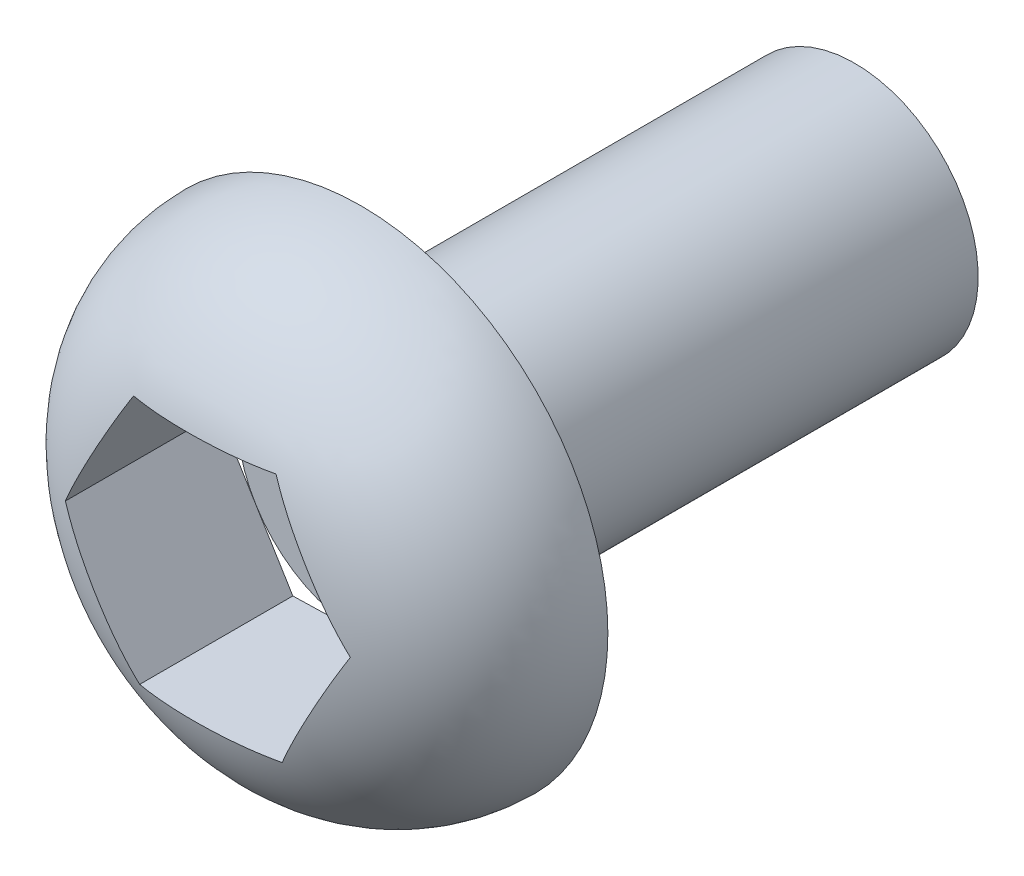
ISO-10303-21;
HEADER;
FILE_DESCRIPTION(('STEP AP214'),'2;1');
FILE_NAME('part.step','',(''),(''),'','','');
FILE_SCHEMA(('AUTOMOTIVE_DESIGN { 1 0 10303 214 1 1 1 1 }'));
ENDSEC;
DATA;
#1=APPLICATION_CONTEXT('core data for automotive mechanical design processes');
#2=APPLICATION_PROTOCOL_DEFINITION('international standard','automotive_design',2000,#1);
#3=PRODUCT_CONTEXT('',#1,'mechanical');
#4=PRODUCT('Part','Part','',(#3));
#5=PRODUCT_RELATED_PRODUCT_CATEGORY('part','',(#4));
#6=PRODUCT_DEFINITION_FORMATION('','',#4);
#7=PRODUCT_DEFINITION_CONTEXT('part definition',#1,'design');
#8=PRODUCT_DEFINITION('design','',#6,#7);
#9=PRODUCT_DEFINITION_SHAPE('','',#8);
#10=(LENGTH_UNIT() NAMED_UNIT(*) SI_UNIT(.MILLI.,.METRE.));
#11=(NAMED_UNIT(*) PLANE_ANGLE_UNIT() SI_UNIT($,.RADIAN.));
#12=(NAMED_UNIT(*) SI_UNIT($,.STERADIAN.) SOLID_ANGLE_UNIT());
#13=UNCERTAINTY_MEASURE_WITH_UNIT(LENGTH_MEASURE(1.E-05),#10,'distance_accuracy_value','');
#14=(GEOMETRIC_REPRESENTATION_CONTEXT(3) GLOBAL_UNCERTAINTY_ASSIGNED_CONTEXT((#13)) GLOBAL_UNIT_ASSIGNED_CONTEXT((#10,
#11,#12)) REPRESENTATION_CONTEXT('',''));
#15=CARTESIAN_POINT('',(0.,0.,0.));
#16=DIRECTION('',(0.,0.,1.));
#17=DIRECTION('',(1.,0.,0.));
#18=AXIS2_PLACEMENT_3D('',#15,#16,#17);
#19=CARTESIAN_POINT('',(0.,0.,-6.));
#20=DIRECTION('',(0.,0.,1.));
#21=DIRECTION('',(1.,0.,0.));
#22=AXIS2_PLACEMENT_3D('',#19,#20,#21);
#23=CYLINDRICAL_SURFACE('',#22,1.5);
#24=CARTESIAN_POINT('',(0.,0.,-6.));
#25=DIRECTION('',(0.,0.,-1.));
#26=DIRECTION('',(-1.,0.,0.));
#27=AXIS2_PLACEMENT_3D('',#24,#25,#26);
#28=CIRCLE('',#27,1.5);
#29=CARTESIAN_POINT('',(-1.5,0.,-6.));
#30=VERTEX_POINT('',#29);
#31=EDGE_CURVE('E11',#30,#30,#28,.T.);
#32=ORIENTED_EDGE('',*,*,#31,.F.);
#33=EDGE_LOOP('',(#32));
#34=FACE_BOUND('',#33,.T.);
#35=CARTESIAN_POINT('',(0.,0.,0.));
#36=DIRECTION('',(0.,0.,-1.));
#37=DIRECTION('',(-1.,0.,0.));
#38=AXIS2_PLACEMENT_3D('',#35,#36,#37);
#39=CIRCLE('',#38,1.5);
#40=CARTESIAN_POINT('',(-1.5,0.,0.));
#41=VERTEX_POINT('',#40);
#42=EDGE_CURVE('E43',#41,#41,#39,.T.);
#43=ORIENTED_EDGE('',*,*,#42,.T.);
#44=EDGE_LOOP('',(#43));
#45=FACE_BOUND('',#44,.T.);
#46=ADVANCED_FACE('F40',(#34,#45),#23,.T.);
#47=CARTESIAN_POINT('',(0.,0.,-6.));
#48=DIRECTION('',(0.,0.,-1.));
#49=DIRECTION('',(-1.,0.,0.));
#50=AXIS2_PLACEMENT_3D('',#47,#48,#49);
#51=PLANE('',#50);
#52=ORIENTED_EDGE('',*,*,#31,.T.);
#53=EDGE_LOOP('',(#52));
#54=FACE_BOUND('',#53,.T.);
#55=ADVANCED_FACE('F55',(#54),#51,.T.);
#56=CARTESIAN_POINT('',(0.,0.,0.));
#57=DIRECTION('',(0.,0.,-1.));
#58=DIRECTION('',(-1.,0.,0.));
#59=AXIS2_PLACEMENT_3D('',#56,#57,#58);
#60=PLANE('',#59);
#61=ORIENTED_EDGE('',*,*,#42,.F.);
#62=EDGE_LOOP('',(#61));
#63=FACE_BOUND('',#62,.T.);
#64=ADVANCED_FACE('F53',(#63),#60,.F.);
#65=CLOSED_SHELL('',(#46,#55,#64));
#66=MANIFOLD_SOLID_BREP('B2',#65);
#67=CARTESIAN_POINT('',(0.,0.,0.));
#68=DIRECTION('',(0.,0.,1.));
#69=DIRECTION('',(1.,0.,0.));
#70=AXIS2_PLACEMENT_3D('',#67,#68,#69);
#71=PLANE('',#70);
#72=DIRECTION('',(0.521372639478787,-0.853329110486056,0.));
#73=VECTOR('',#72,1.);
#74=CARTESIAN_POINT('',(-1.73151561635586,-0.0430542717484789,0.));
#75=LINE('',#74,#73);
#76=CARTESIAN_POINT('',(-1.73151561635586,-0.0430542717484789,0.));
#77=VERTEX_POINT('',#76);
#78=CARTESIAN_POINT('',(-1.27999366572909,-0.782058959218184,0.));
#79=VERTEX_POINT('',#78);
#80=EDGE_CURVE('E170',#77,#79,#75,.T.);
#81=ORIENTED_EDGE('',*,*,#80,.T.);
#82=CARTESIAN_POINT('',(-0.828471715102311,-1.52106364668789,0.));
#83=VERTEX_POINT('',#82);
#84=EDGE_CURVE('E109',#79,#83,#75,.T.);
#85=ORIENTED_EDGE('',*,*,#84,.T.);
#86=DIRECTION('',(0.999691007209096,0.0248573953837473,0.));
#87=VECTOR('',#86,1.);
#88=CARTESIAN_POINT('',(-0.828471715102311,-1.52106364668789,0.));
#89=LINE('',#88,#87);
#90=CARTESIAN_POINT('',(0.0372860930756212,-1.49953651081365,0.));
#91=VERTEX_POINT('',#90);
#92=EDGE_CURVE('E161',#83,#91,#89,.T.);
#93=ORIENTED_EDGE('',*,*,#92,.T.);
#94=CARTESIAN_POINT('',(0.903043901253554,-1.47800937493941,0.));
#95=VERTEX_POINT('',#94);
#96=EDGE_CURVE('E101',#91,#95,#89,.T.);
#97=ORIENTED_EDGE('',*,*,#96,.T.);
#98=DIRECTION('',(0.478318367730309,0.878186505869803,0.));
#99=VECTOR('',#98,1.);
#100=CARTESIAN_POINT('',(0.903043901253554,-1.47800937493941,0.));
#101=LINE('',#100,#99);
#102=CARTESIAN_POINT('',(1.31727975880471,-0.717477551595466,0.));
#103=VERTEX_POINT('',#102);
#104=EDGE_CURVE('E160',#95,#103,#101,.T.);
#105=ORIENTED_EDGE('',*,*,#104,.T.);
#106=CARTESIAN_POINT('',(1.73151561635587,0.0430542717484784,0.));
#107=VERTEX_POINT('',#106);
#108=EDGE_CURVE('E174',#103,#107,#101,.T.);
#109=ORIENTED_EDGE('',*,*,#108,.T.);
#110=DIRECTION('',(-0.521372639478787,0.853329110486056,0.));
#111=VECTOR('',#110,1.);
#112=CARTESIAN_POINT('',(1.73151561635587,0.0430542717484784,0.));
#113=LINE('',#112,#111);
#114=CARTESIAN_POINT('',(1.27999366572909,0.782058959218184,0.));
#115=VERTEX_POINT('',#114);
#116=EDGE_CURVE('E177',#107,#115,#113,.T.);
#117=ORIENTED_EDGE('',*,*,#116,.T.);
#118=CARTESIAN_POINT('',(0.828471715102311,1.52106364668789,0.));
#119=VERTEX_POINT('',#118);
#120=EDGE_CURVE('E175',#115,#119,#113,.T.);
#121=ORIENTED_EDGE('',*,*,#120,.T.);
#122=DIRECTION('',(-0.999691007209096,-0.0248573953837472,0.));
#123=VECTOR('',#122,1.);
#124=CARTESIAN_POINT('',(0.828471715102311,1.52106364668789,0.));
#125=LINE('',#124,#123);
#126=CARTESIAN_POINT('',(-0.0372860930756214,1.49953651081365,0.));
#127=VERTEX_POINT('',#126);
#128=EDGE_CURVE('E182',#119,#127,#125,.T.);
#129=ORIENTED_EDGE('',*,*,#128,.T.);
#130=CARTESIAN_POINT('',(-0.903043901253553,1.47800937493941,0.));
#131=VERTEX_POINT('',#130);
#132=EDGE_CURVE('E181',#127,#131,#125,.T.);
#133=ORIENTED_EDGE('',*,*,#132,.T.);
#134=DIRECTION('',(-0.478318367730308,-0.878186505869803,0.));
#135=VECTOR('',#134,1.);
#136=CARTESIAN_POINT('',(-0.903043901253553,1.47800937493941,0.));
#137=LINE('',#136,#135);
#138=CARTESIAN_POINT('',(-1.31727975880471,0.717477551595465,0.));
#139=VERTEX_POINT('',#138);
#140=EDGE_CURVE('E186',#131,#139,#137,.T.);
#141=ORIENTED_EDGE('',*,*,#140,.T.);
#142=EDGE_CURVE('E185',#139,#77,#137,.T.);
#143=ORIENTED_EDGE('',*,*,#142,.T.);
#144=EDGE_LOOP('',(#81,#85,#93,#97,#105,#109,#117,#121,#129,#133,#141,#143));
#145=FACE_BOUND('',#144,.T.);
#146=CARTESIAN_POINT('',(0.,0.,0.));
#147=DIRECTION('',(0.,0.,1.));
#148=DIRECTION('',(1.,0.,0.));
#149=AXIS2_PLACEMENT_3D('',#146,#147,#148);
#150=CIRCLE('',#149,3.);
#151=CARTESIAN_POINT('',(3.,0.,0.));
#152=VERTEX_POINT('',#151);
#153=EDGE_CURVE('E192',#152,#152,#150,.T.);
#154=ORIENTED_EDGE('',*,*,#153,.F.);
#155=EDGE_LOOP('',(#154));
#156=FACE_BOUND('',#155,.T.);
#157=ADVANCED_FACE('F80',(#145,#156),#71,.F.);
#158=CARTESIAN_POINT('',(0.,0.,0.));
#159=DIRECTION('',(0.,0.,1.));
#160=DIRECTION('',(1.,0.,0.));
#161=AXIS2_PLACEMENT_3D('',#158,#159,#160);
#162=DEGENERATE_TOROIDAL_SURFACE('',#161,1.,2.,.T.);
#163=CARTESIAN_POINT('',(-0.828671715101672,-1.52106861970358,1.86117036754525));
#164=CARTESIAN_POINT('',(-0.765966553261592,-1.5195094509312,1.87350378303623));
#165=CARTESIAN_POINT('',(-0.702928643774431,-1.51794200836246,1.88399281541913));
#166=CARTESIAN_POINT('',(-0.576443559137105,-1.51479694680214,1.90175672912946));
#167=CARTESIAN_POINT('',(-0.512996709152393,-1.51321933589582,1.90903390522359));
#168=CARTESIAN_POINT('',(-0.385738320870283,-1.51005504607965,1.92087628413406));
#169=CARTESIAN_POINT('',(-0.321926317699427,-1.50846835561069,1.92543628547369));
#170=CARTESIAN_POINT('',(-0.194167795691199,-1.50529162993015,1.93220786361133));
#171=CARTESIAN_POINT('',(-0.130221250902539,-1.5037015940733,1.93441893572339));
#172=CARTESIAN_POINT('',(-0.00328276884435323,-1.5005452587505,1.93669521881096));
#173=CARTESIAN_POINT('',(0.0597085639782001,-1.49897897431418,1.93679323546166));
#174=CARTESIAN_POINT('',(0.18565157643713,-1.49584739142113,1.93493188358785));
#175=CARTESIAN_POINT('',(0.248603256240986,-1.49428209296024,1.93297252381203));
#176=CARTESIAN_POINT('',(0.43720269598584,-1.48959255308333,1.92375441500835));
#177=CARTESIAN_POINT('',(0.562748390564888,-1.48647084953056,1.91315901000463));
#178=CARTESIAN_POINT('',(0.705501327273295,-1.48292128655124,1.89413681004035));
#179=CARTESIAN_POINT('',(0.723530816900954,-1.48247298187608,1.89160587135801));
#180=CARTESIAN_POINT('',(0.759549522614612,-1.48157737393055,1.88627745550945));
#181=CARTESIAN_POINT('',(0.777538741595959,-1.48113007058818,1.88347999817915));
#182=CARTESIAN_POINT('',(0.813510580385348,-1.48023562799239,1.87760142504886));
#183=CARTESIAN_POINT('',(0.831493102436685,-1.47978849116971,1.8745197109786));
#184=CARTESIAN_POINT('',(0.867408183704175,-1.47889545985417,1.86806577428298));
#185=CARTESIAN_POINT('',(0.885340736609249,-1.47844956551823,1.86469351653898));
#186=CARTESIAN_POINT('',(0.90324390125292,-1.47800440192372,1.86117036754528));
#187=B_SPLINE_CURVE_WITH_KNOTS('',3,(#163,#164,#165,#166,#167,#168,#169,#170,#171,#172,#173,
#174,#175,#176,#177,#178,#179,#180,#181,#182,#183,#184,#185,#186),.UNSPECIFIED.,.F.,.F.,(4,2,2,
2,2,2,2,2,2,2,2,4),(0.,0.191707008191912,0.383276825367631,0.575212195470817,0.767188796065346,
0.956182732010759,1.14517586429125,1.52270193708336,1.57733644031974,1.631966880499,
1.68671504479797,1.741469835935),.UNSPECIFIED.);
#188=CARTESIAN_POINT('',(-0.828471715102311,-1.52106364668789,1.8612097182042));
#189=VERTEX_POINT('',#188);
#190=CARTESIAN_POINT('',(0.903043901253552,-1.47800937493941,1.8612097182042));
#191=VERTEX_POINT('',#190);
#192=EDGE_CURVE('E38',#189,#191,#187,.T.);
#193=ORIENTED_EDGE('',*,*,#192,.F.);
#194=CARTESIAN_POINT('',(-1.73163781367295,-0.0428542717484789,1.86116361686263));
#195=CARTESIAN_POINT('',(-1.69893569671316,-0.0963777332101476,1.87349745497733));
#196=CARTESIAN_POINT('',(-1.66606003222183,-0.150185239421195,1.88398693744174));
#197=CARTESIAN_POINT('',(-1.60009524319698,-0.258149621284898,1.90175178425041));
#198=CARTESIAN_POINT('',(-1.56700628826867,-0.312306219345194,1.90902944346861));
#199=CARTESIAN_POINT('',(-1.50063819495245,-0.420930688191132,1.92087279753581));
#200=CARTESIAN_POINT('',(-1.46735881419053,-0.475398955669621,1.92543329304326));
#201=CARTESIAN_POINT('',(-1.40072988773599,-0.584450329368341,1.93220588293181));
#202=CARTESIAN_POINT('',(-1.36738032850618,-0.639033457744862,1.93441747261344));
#203=CARTESIAN_POINT('',(-1.30117905119309,-0.747384899314745,1.93669484127734));
#204=CARTESIAN_POINT('',(-1.26832764848591,-0.801152696332938,1.93679342509328));
#205=CARTESIAN_POINT('',(-1.20264551211647,-0.908654461402524,1.93493332131723));
#206=CARTESIAN_POINT('',(-1.16981477836669,-0.962388429597165,1.93297464249616));
#207=CARTESIAN_POINT('',(-1.07145583560961,-1.12337223038724,1.92375885515234));
#208=CARTESIAN_POINT('',(-1.00598083698699,-1.23053497369798,1.91316536923205));
#209=CARTESIAN_POINT('',(-0.931527165527318,-1.35239308520652,1.89414487327692));
#210=CARTESIAN_POINT('',(-0.922119770991773,-1.36779014098419,1.89161301503854));
#211=CARTESIAN_POINT('',(-0.903326003599466,-1.39854984641789,1.88628252004107));
#212=CARTESIAN_POINT('',(-0.893939629230037,-1.4139124985497,1.88348390315423));
#213=CARTESIAN_POINT('',(-0.875170323773509,-1.44463216720295,1.87760274959268));
#214=CARTESIAN_POINT('',(-0.865787443740509,-1.4599891001643,1.87451961379978));
#215=CARTESIAN_POINT('',(-0.847047765382749,-1.49066027822959,1.86806255977518));
#216=CARTESIAN_POINT('',(-0.837690970355875,-1.50597451793589,1.86468860635665));
#217=CARTESIAN_POINT('',(-0.82834951778522,-1.52126364668789,1.86116361686266));
#218=B_SPLINE_CURVE_WITH_KNOTS('',3,(#194,#195,#196,#197,#198,#199,#200,#201,#202,#203,#204,
#205,#206,#207,#208,#209,#210,#211,#212,#213,#214,#215,#216,#217),.UNSPECIFIED.,.F.,.F.,(4,2,2,
2,2,2,2,2,2,2,2,4),(0.,0.191703055206573,0.383268914372694,0.575200170686662,0.767172658121655,
0.956162538616065,1.14515161337473,1.52266971594647,1.57732970995917,1.63198563523767,
1.68675939789281,1.74153979710494),.UNSPECIFIED.);
#219=CARTESIAN_POINT('',(-1.73151561635586,-0.0430542717484789,1.8612097182042));
#220=VERTEX_POINT('',#219);
#221=EDGE_CURVE('E94',#220,#189,#218,.T.);
#222=ORIENTED_EDGE('',*,*,#221,.F.);
#223=CARTESIAN_POINT('',(-0.902934968045281,1.47820937493941,1.8611649220241));
#224=CARTESIAN_POINT('',(-0.932936718802925,1.42312653797278,1.87349867843235));
#225=CARTESIAN_POINT('',(-0.963097684275443,1.36775138479258,1.88398807388155));
#226=CARTESIAN_POINT('',(-1.0236154454978,1.25664153650658,1.901752740292));
#227=CARTESIAN_POINT('',(-1.05397208565183,1.20090712707272,1.90903030610646));
#228=CARTESIAN_POINT('',(-1.11485984676843,1.0891179636355,1.92087347164383));
#229=CARTESIAN_POINT('',(-1.14539119010308,1.03306280135981,1.92543387161238));
#230=CARTESIAN_POINT('',(-1.20651824571847,0.920834296233174,1.93220626589669));
#231=CARTESIAN_POINT('',(-1.23711397041804,0.864660930581403,1.93441775551558));
#232=CARTESIAN_POINT('',(-1.29784868638485,0.753152756113896,1.93669491430397));
#233=CARTESIAN_POINT('',(-1.32798738834355,0.697818478464985,1.93679338846982));
#234=CARTESIAN_POINT('',(-1.38824582801129,0.587184741290966,1.93493304340029));
#235=CARTESIAN_POINT('',(-1.4183655658006,0.531885281618494,1.93297423293155));
#236=CARTESIAN_POINT('',(-1.50860251694165,0.366211374511539,1.92375799678599));
#237=CARTESIAN_POINT('',(-1.56867091037906,0.255926559825602,1.91316413985631));
#238=CARTESIAN_POINT('',(-1.63697572882289,0.130519772442767,1.89414331445476));
#239=CARTESIAN_POINT('',(-1.64560549143181,0.114675636855889,1.8916116339789));
#240=CARTESIAN_POINT('',(-1.66284573404744,0.0830227682972245,1.88628154092131));
#241=CARTESIAN_POINT('',(-1.67145621544142,0.0672140327784016,1.88348314820481));
#242=CARTESIAN_POINT('',(-1.68867401957081,0.0356023609981858,1.87760249351455));
#243=CARTESIAN_POINT('',(-1.69728129548064,0.0197995107079627,1.87451963258659));
#244=CARTESIAN_POINT('',(-1.71447192371431,-0.0117622664695957,1.86806318125293));
#245=CARTESIAN_POINT('',(-1.72305527301376,-0.0275211878041595,1.86468955567359));
#246=CARTESIAN_POINT('',(-1.73162454956414,-0.0432542717484824,1.86116492202413));
#247=B_SPLINE_CURVE_WITH_KNOTS('',3,(#223,#224,#225,#226,#227,#228,#229,#230,#231,#232,#233,
#234,#235,#236,#237,#238,#239,#240,#241,#242,#243,#244,#245,#246),.UNSPECIFIED.,.F.,.F.,(4,2,2,
2,2,2,2,2,2,2,2,4),(0.,0.191703819449054,0.383270443828847,0.575202495472803,0.767175778116085,
0.956166442662227,1.14515630187296,1.52267594535045,1.57733101115074,1.63198200931479,
1.68675082295466,1.74152627127176),.UNSPECIFIED.);
#248=CARTESIAN_POINT('',(-0.903043901253553,1.47800937493941,1.8612097182042));
#249=VERTEX_POINT('',#248);
#250=EDGE_CURVE('E252',#249,#220,#247,.T.);
#251=ORIENTED_EDGE('',*,*,#250,.F.);
#252=CARTESIAN_POINT('',(0.828671715101672,1.52106861970358,1.86117036754525));
#253=CARTESIAN_POINT('',(0.765966553261592,1.5195094509312,1.87350378303623));
#254=CARTESIAN_POINT('',(0.702928643774431,1.51794200836246,1.88399281541913));
#255=CARTESIAN_POINT('',(0.576443559137105,1.51479694680214,1.90175672912946));
#256=CARTESIAN_POINT('',(0.512996709152393,1.51321933589582,1.90903390522359));
#257=CARTESIAN_POINT('',(0.385738320870283,1.51005504607965,1.92087628413406));
#258=CARTESIAN_POINT('',(0.321926317699427,1.50846835561069,1.92543628547369));
#259=CARTESIAN_POINT('',(0.194167795691199,1.50529162993015,1.93220786361133));
#260=CARTESIAN_POINT('',(0.130221250902539,1.5037015940733,1.93441893572339));
#261=CARTESIAN_POINT('',(0.00328276884435316,1.5005452587505,1.93669521881096));
#262=CARTESIAN_POINT('',(-0.0597085639782003,1.49897897431418,1.93679323546166));
#263=CARTESIAN_POINT('',(-0.18565157643713,1.49584739142113,1.93493188358785));
#264=CARTESIAN_POINT('',(-0.248603256240986,1.49428209296024,1.93297252381203));
#265=CARTESIAN_POINT('',(-0.43720269598584,1.48959255308333,1.92375441500835));
#266=CARTESIAN_POINT('',(-0.562748390564889,1.48647084953056,1.91315901000464));
#267=CARTESIAN_POINT('',(-0.705501327273296,1.48292128655124,1.89413681004035));
#268=CARTESIAN_POINT('',(-0.723530816900954,1.48247298187608,1.89160587135801));
#269=CARTESIAN_POINT('',(-0.759549522614612,1.48157737393055,1.88627745550945));
#270=CARTESIAN_POINT('',(-0.777538741595959,1.48113007058818,1.88347999817915));
#271=CARTESIAN_POINT('',(-0.813510580385348,1.4802356279924,1.87760142504886));
#272=CARTESIAN_POINT('',(-0.831493102436685,1.47978849116971,1.8745197109786));
#273=CARTESIAN_POINT('',(-0.867408183704174,1.47889545985417,1.86806577428298));
#274=CARTESIAN_POINT('',(-0.885340736609249,1.47844956551823,1.86469351653898));
#275=CARTESIAN_POINT('',(-0.90324390125292,1.47800440192372,1.86117036754528));
#276=B_SPLINE_CURVE_WITH_KNOTS('',3,(#252,#253,#254,#255,#256,#257,#258,#259,#260,#261,#262,
#263,#264,#265,#266,#267,#268,#269,#270,#271,#272,#273,#274,#275),.UNSPECIFIED.,.F.,.F.,(4,2,2,
2,2,2,2,2,2,2,2,4),(0.,0.191707008191912,0.38327682536763,0.575212195470817,0.767188796065346,
0.956182732010759,1.14517586429125,1.52270193708336,1.57733644031974,1.631966880499,
1.68671504479797,1.741469835935),.UNSPECIFIED.);
#277=CARTESIAN_POINT('',(0.828471715102311,1.52106364668789,1.8612097182042));
#278=VERTEX_POINT('',#277);
#279=EDGE_CURVE('E253',#278,#249,#276,.T.);
#280=ORIENTED_EDGE('',*,*,#279,.F.);
#281=CARTESIAN_POINT('',(1.73163781367295,0.0428542717484784,1.86116361686263));
#282=CARTESIAN_POINT('',(1.69893569671316,0.096377733210147,1.87349745497733));
#283=CARTESIAN_POINT('',(1.66606003222183,0.150185239421194,1.88398693744174));
#284=CARTESIAN_POINT('',(1.60009524319698,0.258149621284897,1.90175178425041));
#285=CARTESIAN_POINT('',(1.56700628826867,0.312306219345193,1.90902944346861));
#286=CARTESIAN_POINT('',(1.50063819495245,0.420930688191131,1.92087279753581));
#287=CARTESIAN_POINT('',(1.46735881419053,0.47539895566962,1.92543329304326));
#288=CARTESIAN_POINT('',(1.40072988773599,0.58445032936834,1.93220588293181));
#289=CARTESIAN_POINT('',(1.36738032850618,0.639033457744861,1.93441747261344));
#290=CARTESIAN_POINT('',(1.30117905119309,0.747384899314744,1.93669484127734));
#291=CARTESIAN_POINT('',(1.26832764848591,0.801152696332937,1.93679342509328));
#292=CARTESIAN_POINT('',(1.20264551211647,0.908654461402523,1.93493332131723));
#293=CARTESIAN_POINT('',(1.16981477836669,0.962388429597164,1.93297464249616));
#294=CARTESIAN_POINT('',(1.07145583560961,1.12337223038723,1.92375885515234));
#295=CARTESIAN_POINT('',(1.00598083698699,1.23053497369798,1.91316536923205));
#296=CARTESIAN_POINT('',(0.931527165527319,1.35239308520652,1.89414487327692));
#297=CARTESIAN_POINT('',(0.922119770991774,1.36779014098419,1.89161301503854));
#298=CARTESIAN_POINT('',(0.903326003599467,1.39854984641789,1.88628252004107));
#299=CARTESIAN_POINT('',(0.893939629230037,1.4139124985497,1.88348390315423));
#300=CARTESIAN_POINT('',(0.87517032377351,1.44463216720295,1.87760274959268));
#301=CARTESIAN_POINT('',(0.865787443740509,1.4599891001643,1.87451961379978));
#302=CARTESIAN_POINT('',(0.847047765382749,1.49066027822959,1.86806255977518));
#303=CARTESIAN_POINT('',(0.837690970355875,1.50597451793589,1.86468860635665));
#304=CARTESIAN_POINT('',(0.82834951778522,1.52126364668789,1.86116361686266));
#305=B_SPLINE_CURVE_WITH_KNOTS('',3,(#281,#282,#283,#284,#285,#286,#287,#288,#289,#290,#291,
#292,#293,#294,#295,#296,#297,#298,#299,#300,#301,#302,#303,#304),.UNSPECIFIED.,.F.,.F.,(4,2,2,
2,2,2,2,2,2,2,2,4),(0.,0.191703055206573,0.383268914372693,0.575200170686661,0.767172658121654,
0.956162538616064,1.14515161337473,1.52266971594647,1.57732970995917,1.63198563523767,
1.68675939789281,1.74153979710494),.UNSPECIFIED.);
#306=CARTESIAN_POINT('',(1.73151561635587,0.0430542717484784,1.8612097182042));
#307=VERTEX_POINT('',#306);
#308=EDGE_CURVE('E213',#307,#278,#305,.T.);
#309=ORIENTED_EDGE('',*,*,#308,.F.);
#310=CARTESIAN_POINT('',(0.902934968045281,-1.47820937493941,1.8611649220241));
#311=CARTESIAN_POINT('',(0.932936718802925,-1.42312653797278,1.87349867843235));
#312=CARTESIAN_POINT('',(0.963097684275444,-1.36775138479258,1.88398807388155));
#313=CARTESIAN_POINT('',(1.0236154454978,-1.25664153650658,1.901752740292));
#314=CARTESIAN_POINT('',(1.05397208565183,-1.20090712707272,1.90903030610646));
#315=CARTESIAN_POINT('',(1.11485984676843,-1.0891179636355,1.92087347164383));
#316=CARTESIAN_POINT('',(1.14539119010308,-1.03306280135982,1.92543387161238));
#317=CARTESIAN_POINT('',(1.20651824571847,-0.920834296233174,1.93220626589669));
#318=CARTESIAN_POINT('',(1.23711397041804,-0.864660930581403,1.93441775551558));
#319=CARTESIAN_POINT('',(1.29784868638485,-0.753152756113896,1.93669491430397));
#320=CARTESIAN_POINT('',(1.32798738834355,-0.697818478464985,1.93679338846982));
#321=CARTESIAN_POINT('',(1.38824582801129,-0.587184741290966,1.93493304340029));
#322=CARTESIAN_POINT('',(1.4183655658006,-0.531885281618495,1.93297423293155));
#323=CARTESIAN_POINT('',(1.50860251694165,-0.366211374511539,1.92375799678599));
#324=CARTESIAN_POINT('',(1.56867091037906,-0.255926559825602,1.91316413985631));
#325=CARTESIAN_POINT('',(1.63697572882289,-0.130519772442768,1.89414331445476));
#326=CARTESIAN_POINT('',(1.64560549143181,-0.114675636855889,1.8916116339789));
#327=CARTESIAN_POINT('',(1.66284573404744,-0.0830227682972249,1.88628154092131));
#328=CARTESIAN_POINT('',(1.67145621544142,-0.067214032778402,1.88348314820481));
#329=CARTESIAN_POINT('',(1.68867401957081,-0.0356023609981861,1.87760249351455));
#330=CARTESIAN_POINT('',(1.69728129548064,-0.019799510707963,1.87451963258659));
#331=CARTESIAN_POINT('',(1.71447192371431,0.0117622664695954,1.86806318125293));
#332=CARTESIAN_POINT('',(1.72305527301376,0.0275211878041591,1.86468955567359));
#333=CARTESIAN_POINT('',(1.73162454956414,0.043254271748482,1.86116492202413));
#334=B_SPLINE_CURVE_WITH_KNOTS('',3,(#310,#311,#312,#313,#314,#315,#316,#317,#318,#319,#320,
#321,#322,#323,#324,#325,#326,#327,#328,#329,#330,#331,#332,#333),.UNSPECIFIED.,.F.,.F.,(4,2,2,
2,2,2,2,2,2,2,2,4),(0.,0.191703819449054,0.383270443828847,0.575202495472802,0.767175778116084,
0.956166442662226,1.14515630187296,1.52267594535045,1.57733101115074,1.63198200931479,
1.68675082295466,1.74152627127176),.UNSPECIFIED.);
#335=EDGE_CURVE('E206',#191,#307,#334,.T.);
#336=ORIENTED_EDGE('',*,*,#335,.F.);
#337=EDGE_LOOP('',(#193,#222,#251,#280,#309,#336));
#338=FACE_BOUND('',#337,.T.);
#339=ORIENTED_EDGE('',*,*,#153,.T.);
#340=EDGE_LOOP('',(#339));
#341=FACE_BOUND('',#340,.T.);
#342=ADVANCED_FACE('F82',(#338,#341),#162,.T.);
#343=CARTESIAN_POINT('',(-0.828471715102311,-1.52106364668789,0.));
#344=DIRECTION('',(0.0248573953837473,-0.999691007209096,0.));
#345=DIRECTION('',(0.999691007209096,0.0248573953837473,0.));
#346=AXIS2_PLACEMENT_3D('',#343,#344,#345);
#347=PLANE('',#346);
#348=ORIENTED_EDGE('',*,*,#192,.T.);
#349=DIRECTION('',(0.,0.,1.));
#350=VECTOR('',#349,1.);
#351=CARTESIAN_POINT('',(0.903043901253554,-1.47800937493941,0.));
#352=LINE('',#351,#350);
#353=EDGE_CURVE('E163',#95,#191,#352,.T.);
#354=ORIENTED_EDGE('',*,*,#353,.F.);
#355=ORIENTED_EDGE('',*,*,#96,.F.);
#356=ORIENTED_EDGE('',*,*,#92,.F.);
#357=DIRECTION('',(0.,0.,1.));
#358=VECTOR('',#357,1.);
#359=CARTESIAN_POINT('',(-0.828471715102311,-1.52106364668789,0.));
#360=LINE('',#359,#358);
#361=EDGE_CURVE('E190',#83,#189,#360,.T.);
#362=ORIENTED_EDGE('',*,*,#361,.T.);
#363=EDGE_LOOP('',(#348,#354,#355,#356,#362));
#364=FACE_BOUND('',#363,.T.);
#365=ADVANCED_FACE('F164',(#364),#347,.F.);
#366=CARTESIAN_POINT('',(-1.73151561635586,-0.0430542717484789,0.));
#367=DIRECTION('',(-0.853329110486056,-0.521372639478787,0.));
#368=DIRECTION('',(0.521372639478787,-0.853329110486056,0.));
#369=AXIS2_PLACEMENT_3D('',#366,#367,#368);
#370=PLANE('',#369);
#371=ORIENTED_EDGE('',*,*,#221,.T.);
#372=ORIENTED_EDGE('',*,*,#361,.F.);
#373=ORIENTED_EDGE('',*,*,#84,.F.);
#374=ORIENTED_EDGE('',*,*,#80,.F.);
#375=DIRECTION('',(0.,0.,1.));
#376=VECTOR('',#375,1.);
#377=CARTESIAN_POINT('',(-1.73151561635586,-0.0430542717484789,0.));
#378=LINE('',#377,#376);
#379=EDGE_CURVE('E193',#77,#220,#378,.T.);
#380=ORIENTED_EDGE('',*,*,#379,.T.);
#381=EDGE_LOOP('',(#371,#372,#373,#374,#380));
#382=FACE_BOUND('',#381,.T.);
#383=ADVANCED_FACE('F227',(#382),#370,.F.);
#384=CARTESIAN_POINT('',(-0.903043901253553,1.47800937493941,0.));
#385=DIRECTION('',(-0.878186505869803,0.478318367730309,0.));
#386=DIRECTION('',(-0.478318367730309,-0.878186505869803,0.));
#387=AXIS2_PLACEMENT_3D('',#384,#385,#386);
#388=PLANE('',#387);
#389=ORIENTED_EDGE('',*,*,#250,.T.);
#390=ORIENTED_EDGE('',*,*,#379,.F.);
#391=ORIENTED_EDGE('',*,*,#142,.F.);
#392=ORIENTED_EDGE('',*,*,#140,.F.);
#393=DIRECTION('',(0.,0.,1.));
#394=VECTOR('',#393,1.);
#395=CARTESIAN_POINT('',(-0.903043901253553,1.47800937493941,0.));
#396=LINE('',#395,#394);
#397=EDGE_CURVE('E196',#131,#249,#396,.T.);
#398=ORIENTED_EDGE('',*,*,#397,.T.);
#399=EDGE_LOOP('',(#389,#390,#391,#392,#398));
#400=FACE_BOUND('',#399,.T.);
#401=ADVANCED_FACE('F251',(#400),#388,.F.);
#402=CARTESIAN_POINT('',(0.828471715102311,1.52106364668789,0.));
#403=DIRECTION('',(-0.0248573953837472,0.999691007209096,0.));
#404=DIRECTION('',(-0.999691007209096,-0.0248573953837472,0.));
#405=AXIS2_PLACEMENT_3D('',#402,#403,#404);
#406=PLANE('',#405);
#407=ORIENTED_EDGE('',*,*,#279,.T.);
#408=ORIENTED_EDGE('',*,*,#397,.F.);
#409=ORIENTED_EDGE('',*,*,#132,.F.);
#410=ORIENTED_EDGE('',*,*,#128,.F.);
#411=DIRECTION('',(0.,0.,1.));
#412=VECTOR('',#411,1.);
#413=CARTESIAN_POINT('',(0.828471715102311,1.52106364668789,0.));
#414=LINE('',#413,#412);
#415=EDGE_CURVE('E199',#119,#278,#414,.T.);
#416=ORIENTED_EDGE('',*,*,#415,.T.);
#417=EDGE_LOOP('',(#407,#408,#409,#410,#416));
#418=FACE_BOUND('',#417,.T.);
#419=ADVANCED_FACE('F246',(#418),#406,.F.);
#420=CARTESIAN_POINT('',(1.73151561635587,0.0430542717484784,0.));
#421=DIRECTION('',(0.853329110486056,0.521372639478787,0.));
#422=DIRECTION('',(-0.521372639478787,0.853329110486056,0.));
#423=AXIS2_PLACEMENT_3D('',#420,#421,#422);
#424=PLANE('',#423);
#425=ORIENTED_EDGE('',*,*,#308,.T.);
#426=ORIENTED_EDGE('',*,*,#415,.F.);
#427=ORIENTED_EDGE('',*,*,#120,.F.);
#428=ORIENTED_EDGE('',*,*,#116,.F.);
#429=DIRECTION('',(0.,0.,1.));
#430=VECTOR('',#429,1.);
#431=CARTESIAN_POINT('',(1.73151561635587,0.0430542717484784,0.));
#432=LINE('',#431,#430);
#433=EDGE_CURVE('E169',#107,#307,#432,.T.);
#434=ORIENTED_EDGE('',*,*,#433,.T.);
#435=EDGE_LOOP('',(#425,#426,#427,#428,#434));
#436=FACE_BOUND('',#435,.T.);
#437=ADVANCED_FACE('F222',(#436),#424,.F.);
#438=CARTESIAN_POINT('',(0.903043901253554,-1.47800937493941,0.));
#439=DIRECTION('',(0.878186505869803,-0.478318367730309,0.));
#440=DIRECTION('',(0.478318367730309,0.878186505869803,0.));
#441=AXIS2_PLACEMENT_3D('',#438,#439,#440);
#442=PLANE('',#441);
#443=ORIENTED_EDGE('',*,*,#335,.T.);
#444=ORIENTED_EDGE('',*,*,#433,.F.);
#445=ORIENTED_EDGE('',*,*,#108,.F.);
#446=ORIENTED_EDGE('',*,*,#104,.F.);
#447=ORIENTED_EDGE('',*,*,#353,.T.);
#448=EDGE_LOOP('',(#443,#444,#445,#446,#447));
#449=FACE_BOUND('',#448,.T.);
#450=ADVANCED_FACE('F172',(#449),#442,.F.);
#451=CLOSED_SHELL('',(#157,#342,#365,#383,#401,#419,#437,#450));
#452=MANIFOLD_SOLID_BREP('B6',#451);
#453=ADVANCED_BREP_SHAPE_REPRESENTATION('',(#18,#66,#452),#14);
#454=SHAPE_DEFINITION_REPRESENTATION(#9,#453);
ENDSEC;
END-ISO-10303-21;
